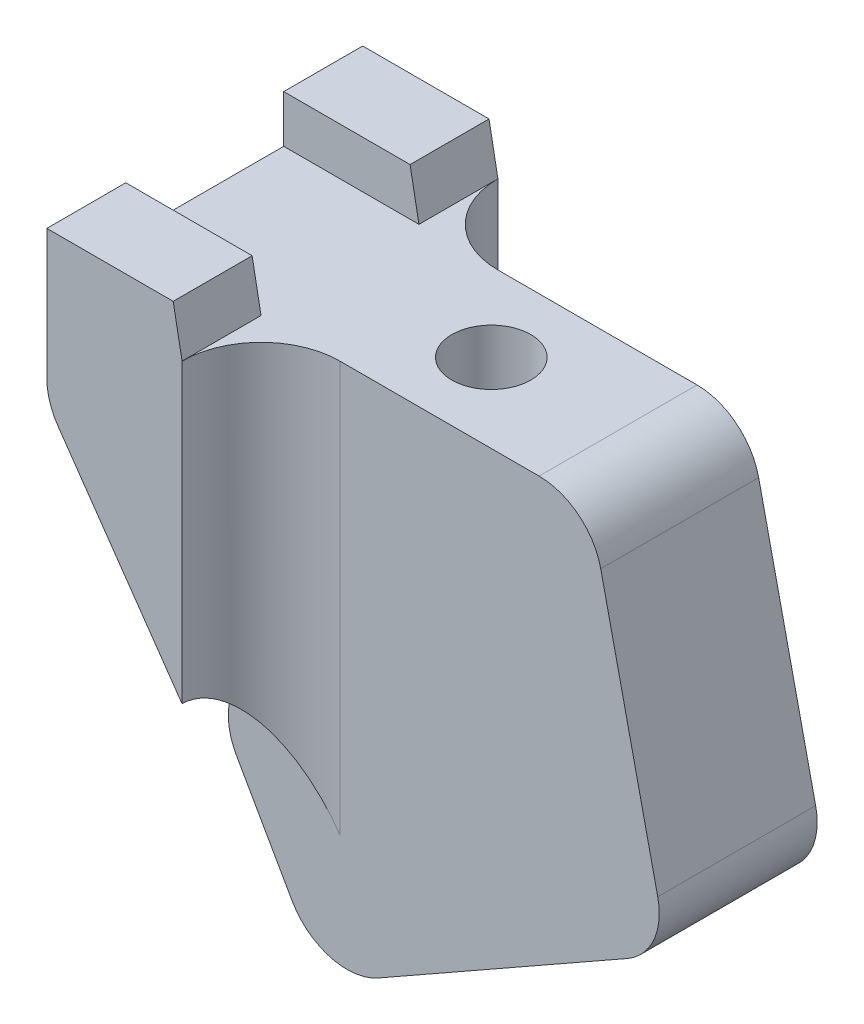
ISO-10303-21;
HEADER;
FILE_DESCRIPTION(('STEP AP214'),'2;1');
FILE_NAME('part.step','',(''),(''),'','','');
FILE_SCHEMA(('AUTOMOTIVE_DESIGN { 1 0 10303 214 1 1 1 1 }'));
ENDSEC;
DATA;
#1=APPLICATION_CONTEXT('core data for automotive mechanical design processes');
#2=APPLICATION_PROTOCOL_DEFINITION('international standard','automotive_design',2000,#1);
#3=PRODUCT_CONTEXT('',#1,'mechanical');
#4=PRODUCT('Part','Part','',(#3));
#5=PRODUCT_RELATED_PRODUCT_CATEGORY('part','',(#4));
#6=PRODUCT_DEFINITION_FORMATION('','',#4);
#7=PRODUCT_DEFINITION_CONTEXT('part definition',#1,'design');
#8=PRODUCT_DEFINITION('design','',#6,#7);
#9=PRODUCT_DEFINITION_SHAPE('','',#8);
#10=(LENGTH_UNIT() NAMED_UNIT(*) SI_UNIT(.MILLI.,.METRE.));
#11=(NAMED_UNIT(*) PLANE_ANGLE_UNIT() SI_UNIT($,.RADIAN.));
#12=(NAMED_UNIT(*) SI_UNIT($,.STERADIAN.) SOLID_ANGLE_UNIT());
#13=UNCERTAINTY_MEASURE_WITH_UNIT(LENGTH_MEASURE(1.E-05),#10,'distance_accuracy_value','');
#14=(GEOMETRIC_REPRESENTATION_CONTEXT(3) GLOBAL_UNCERTAINTY_ASSIGNED_CONTEXT((#13)) GLOBAL_UNIT_ASSIGNED_CONTEXT((#10,
#11,#12)) REPRESENTATION_CONTEXT('',''));
#15=CARTESIAN_POINT('',(0.,0.,0.));
#16=DIRECTION('',(0.,0.,1.));
#17=DIRECTION('',(1.,0.,0.));
#18=AXIS2_PLACEMENT_3D('',#15,#16,#17);
#19=CARTESIAN_POINT('',(48.0061463290764,35.3041192340742,-1.));
#20=DIRECTION('',(0.,0.,1.));
#21=DIRECTION('',(1.,0.,0.));
#22=AXIS2_PLACEMENT_3D('',#19,#20,#21);
#23=PLANE('',#22);
#24=DIRECTION('',(-1.,0.,0.));
#25=VECTOR('',#24,1.);
#26=CARTESIAN_POINT('',(33.9958629757308,64.4408077218012,-1.));
#27=LINE('',#26,#25);
#28=CARTESIAN_POINT('',(60.1642670724651,64.4408077218012,-1.));
#29=VERTEX_POINT('',#28);
#30=CARTESIAN_POINT('',(47.558151595833,64.4408077218012,-1.));
#31=VERTEX_POINT('',#30);
#32=EDGE_CURVE('E339',#29,#31,#27,.T.);
#33=ORIENTED_EDGE('',*,*,#32,.T.);
#34=DIRECTION('',(0.,-1.,0.));
#35=VECTOR('',#34,1.);
#36=CARTESIAN_POINT('',(47.558151595833,45.6512282761422,-1.));
#37=LINE('',#36,#35);
#38=CARTESIAN_POINT('',(47.558151595833,45.6512282761422,-1.));
#39=VERTEX_POINT('',#38);
#40=EDGE_CURVE('E389',#31,#39,#37,.T.);
#41=ORIENTED_EDGE('',*,*,#40,.T.);
#42=DIRECTION('',(0.,1.,0.));
#43=VECTOR('',#42,1.);
#44=CARTESIAN_POINT('',(47.558151595833,42.0557055238076,-1.));
#45=LINE('',#44,#43);
#46=CARTESIAN_POINT('',(47.558151595833,38.4601827714731,-1.));
#47=VERTEX_POINT('',#46);
#48=EDGE_CURVE('E384',#39,#47,#45,.F.);
#49=ORIENTED_EDGE('',*,*,#48,.T.);
#50=DIRECTION('',(-0.570874703175467,0.821037193599853,0.));
#51=VECTOR('',#50,1.);
#52=CARTESIAN_POINT('',(42.558151595833,45.6512282761422,-1.));
#53=LINE('',#52,#51);
#54=CARTESIAN_POINT('',(42.558151595833,45.6512282761422,-1.));
#55=VERTEX_POINT('',#54);
#56=EDGE_CURVE('E387',#47,#55,#53,.T.);
#57=ORIENTED_EDGE('',*,*,#56,.T.);
#58=DIRECTION('',(-0.589185933450439,-0.807997485035774,0.));
#59=VECTOR('',#58,1.);
#60=CARTESIAN_POINT('',(41.2535200061018,43.8620833160314,-1.));
#61=LINE('',#60,#59);
#62=CARTESIAN_POINT('',(41.2535200061018,43.8620833160314,-1.));
#63=VERTEX_POINT('',#62);
#64=EDGE_CURVE('E342',#55,#63,#61,.T.);
#65=ORIENTED_EDGE('',*,*,#64,.T.);
#66=CARTESIAN_POINT('',(44.4855099462449,41.5053395822297,-1.));
#67=DIRECTION('',(0.,0.,1.));
#68=DIRECTION('',(1.,0.,0.));
#69=AXIS2_PLACEMENT_3D('',#66,#67,#68);
#70=CIRCLE('',#69,4.);
#71=CARTESIAN_POINT('',(41.0070130927053,39.5304827165518,-1.));
#72=VERTEX_POINT('',#71);
#73=EDGE_CURVE('E345',#63,#72,#70,.T.);
#74=ORIENTED_EDGE('',*,*,#73,.T.);
#75=DIRECTION('',(0.493714216419472,-0.8696242133849,0.));
#76=VECTOR('',#75,1.);
#77=CARTESIAN_POINT('',(44.5276494755368,33.3292623683963,-1.));
#78=LINE('',#77,#76);
#79=CARTESIAN_POINT('',(44.5276494755368,33.3292623683963,-1.));
#80=VERTEX_POINT('',#79);
#81=EDGE_CURVE('E298',#72,#80,#78,.T.);
#82=ORIENTED_EDGE('',*,*,#81,.T.);
#83=CARTESIAN_POINT('',(48.0061463290764,35.3041192340742,-1.));
#84=DIRECTION('',(0.,0.,1.));
#85=DIRECTION('',(1.,0.,0.));
#86=AXIS2_PLACEMENT_3D('',#83,#84,#85);
#87=CIRCLE('',#86,4.);
#88=CARTESIAN_POINT('',(49.9810031947543,31.8256223805346,-1.));
#89=VERTEX_POINT('',#88);
#90=EDGE_CURVE('E293',#80,#89,#87,.T.);
#91=ORIENTED_EDGE('',*,*,#90,.T.);
#92=DIRECTION('',(0.8696242133849,0.493714216419473,0.));
#93=VECTOR('',#92,1.);
#94=CARTESIAN_POINT('',(65.7477490974415,40.7769216647747,-1.));
#95=LINE('',#94,#93);
#96=CARTESIAN_POINT('',(65.7477490974415,40.7769216647747,-1.));
#97=VERTEX_POINT('',#96);
#98=EDGE_CURVE('E326',#89,#97,#95,.T.);
#99=ORIENTED_EDGE('',*,*,#98,.T.);
#100=CARTESIAN_POINT('',(63.7728922317636,44.2554185183143,-1.));
#101=DIRECTION('',(0.,0.,1.));
#102=DIRECTION('',(-1.,0.,0.));
#103=AXIS2_PLACEMENT_3D('',#100,#101,#102);
#104=CIRCLE('',#103,3.99999999999999);
#105=CARTESIAN_POINT('',(67.6770330899851,45.1258690678376,-1.));
#106=VERTEX_POINT('',#105);
#107=EDGE_CURVE('E329',#97,#106,#104,.T.);
#108=ORIENTED_EDGE('',*,*,#107,.T.);
#109=DIRECTION('',(-0.217612637380822,0.976035214555378,0.));
#110=VECTOR('',#109,1.);
#111=CARTESIAN_POINT('',(64.0684079306866,61.3112582713245,-1.));
#112=LINE('',#111,#110);
#113=CARTESIAN_POINT('',(64.0684079306866,61.3112582713245,-1.));
#114=VERTEX_POINT('',#113);
#115=EDGE_CURVE('E332',#106,#114,#112,.T.);
#116=ORIENTED_EDGE('',*,*,#115,.T.);
#117=CARTESIAN_POINT('',(60.1642670724651,60.4408077218012,-1.));
#118=DIRECTION('',(0.,0.,1.));
#119=DIRECTION('',(-1.,0.,0.));
#120=AXIS2_PLACEMENT_3D('',#117,#118,#119);
#121=CIRCLE('',#120,4.);
#122=EDGE_CURVE('E335',#114,#29,#121,.T.);
#123=ORIENTED_EDGE('',*,*,#122,.T.);
#124=EDGE_LOOP('',(#33,#41,#49,#57,#65,#74,#82,#91,#99,#108,#116,#123));
#125=FACE_BOUND('',#124,.T.);
#126=ADVANCED_FACE('F38',(#125),#23,.T.);
#127=CARTESIAN_POINT('',(48.0061463290764,35.3041192340742,-11.));
#128=DIRECTION('',(0.,0.,1.));
#129=DIRECTION('',(1.,0.,0.));
#130=AXIS2_PLACEMENT_3D('',#127,#128,#129);
#131=PLANE('',#130);
#132=DIRECTION('',(-0.589185933450439,-0.807997485035774,0.));
#133=VECTOR('',#132,1.);
#134=CARTESIAN_POINT('',(41.2535200061018,43.8620833160314,-11.));
#135=LINE('',#134,#133);
#136=CARTESIAN_POINT('',(42.558151595833,45.6512282761422,-11.));
#137=VERTEX_POINT('',#136);
#138=CARTESIAN_POINT('',(41.2535200061018,43.8620833160314,-11.));
#139=VERTEX_POINT('',#138);
#140=EDGE_CURVE('E314',#137,#139,#135,.T.);
#141=ORIENTED_EDGE('',*,*,#140,.F.);
#142=DIRECTION('',(0.570874703175467,-0.821037193599853,0.));
#143=VECTOR('',#142,1.);
#144=CARTESIAN_POINT('',(49.1834286845458,36.122694470947,-11.));
#145=LINE('',#144,#143);
#146=CARTESIAN_POINT('',(47.558151595833,38.4601827714731,-11.));
#147=VERTEX_POINT('',#146);
#148=EDGE_CURVE('E381',#137,#147,#145,.T.);
#149=ORIENTED_EDGE('',*,*,#148,.T.);
#150=DIRECTION('',(0.,1.,0.));
#151=VECTOR('',#150,1.);
#152=CARTESIAN_POINT('',(47.558151595833,42.0557055238076,-11.));
#153=LINE('',#152,#151);
#154=CARTESIAN_POINT('',(47.558151595833,45.6512282761422,-11.));
#155=VERTEX_POINT('',#154);
#156=EDGE_CURVE('E379',#147,#155,#153,.T.);
#157=ORIENTED_EDGE('',*,*,#156,.T.);
#158=DIRECTION('',(0.,-1.,0.));
#159=VECTOR('',#158,1.);
#160=CARTESIAN_POINT('',(47.558151595833,64.4408077218012,-11.));
#161=LINE('',#160,#159);
#162=CARTESIAN_POINT('',(47.558151595833,64.4408077218012,-11.));
#163=VERTEX_POINT('',#162);
#164=EDGE_CURVE('E353',#155,#163,#161,.F.);
#165=ORIENTED_EDGE('',*,*,#164,.T.);
#166=DIRECTION('',(-1.,0.,0.));
#167=VECTOR('',#166,1.);
#168=CARTESIAN_POINT('',(33.9958629757308,64.4408077218012,-11.));
#169=LINE('',#168,#167);
#170=CARTESIAN_POINT('',(60.1642670724651,64.4408077218012,-11.));
#171=VERTEX_POINT('',#170);
#172=EDGE_CURVE('E311',#171,#163,#169,.T.);
#173=ORIENTED_EDGE('',*,*,#172,.F.);
#174=CARTESIAN_POINT('',(60.1642670724651,60.4408077218012,-11.));
#175=DIRECTION('',(0.,0.,1.));
#176=DIRECTION('',(-1.,0.,0.));
#177=AXIS2_PLACEMENT_3D('',#174,#175,#176);
#178=CIRCLE('',#177,4.);
#179=CARTESIAN_POINT('',(64.0684079306866,61.3112582713245,-11.));
#180=VERTEX_POINT('',#179);
#181=EDGE_CURVE('E307',#180,#171,#178,.T.);
#182=ORIENTED_EDGE('',*,*,#181,.F.);
#183=DIRECTION('',(-0.217612637380822,0.976035214555378,0.));
#184=VECTOR('',#183,1.);
#185=CARTESIAN_POINT('',(64.0684079306866,61.3112582713245,-11.));
#186=LINE('',#185,#184);
#187=CARTESIAN_POINT('',(67.6770330899851,45.1258690678376,-11.));
#188=VERTEX_POINT('',#187);
#189=EDGE_CURVE('E304',#188,#180,#186,.T.);
#190=ORIENTED_EDGE('',*,*,#189,.F.);
#191=CARTESIAN_POINT('',(63.7728922317636,44.2554185183143,-11.));
#192=DIRECTION('',(0.,0.,1.));
#193=DIRECTION('',(-1.,0.,0.));
#194=AXIS2_PLACEMENT_3D('',#191,#192,#193);
#195=CIRCLE('',#194,3.99999999999999);
#196=CARTESIAN_POINT('',(65.7477490974415,40.7769216647747,-11.));
#197=VERTEX_POINT('',#196);
#198=EDGE_CURVE('E301',#197,#188,#195,.T.);
#199=ORIENTED_EDGE('',*,*,#198,.F.);
#200=DIRECTION('',(0.8696242133849,0.493714216419473,0.));
#201=VECTOR('',#200,1.);
#202=CARTESIAN_POINT('',(65.7477490974415,40.7769216647747,-11.));
#203=LINE('',#202,#201);
#204=CARTESIAN_POINT('',(49.9810031947543,31.8256223805346,-11.));
#205=VERTEX_POINT('',#204);
#206=EDGE_CURVE('E297',#205,#197,#203,.T.);
#207=ORIENTED_EDGE('',*,*,#206,.F.);
#208=CARTESIAN_POINT('',(48.0061463290764,35.3041192340742,-11.));
#209=DIRECTION('',(0.,0.,1.));
#210=DIRECTION('',(1.,0.,0.));
#211=AXIS2_PLACEMENT_3D('',#208,#209,#210);
#212=CIRCLE('',#211,4.);
#213=CARTESIAN_POINT('',(44.5276494755368,33.3292623683963,-11.));
#214=VERTEX_POINT('',#213);
#215=EDGE_CURVE('E294',#214,#205,#212,.T.);
#216=ORIENTED_EDGE('',*,*,#215,.F.);
#217=DIRECTION('',(0.493714216419472,-0.8696242133849,0.));
#218=VECTOR('',#217,1.);
#219=CARTESIAN_POINT('',(44.5276494755368,33.3292623683963,-11.));
#220=LINE('',#219,#218);
#221=CARTESIAN_POINT('',(41.0070130927053,39.5304827165518,-11.));
#222=VERTEX_POINT('',#221);
#223=EDGE_CURVE('E320',#222,#214,#220,.T.);
#224=ORIENTED_EDGE('',*,*,#223,.F.);
#225=CARTESIAN_POINT('',(44.4855099462449,41.5053395822297,-11.));
#226=DIRECTION('',(0.,0.,1.));
#227=DIRECTION('',(1.,0.,0.));
#228=AXIS2_PLACEMENT_3D('',#225,#226,#227);
#229=CIRCLE('',#228,4.);
#230=EDGE_CURVE('E317',#139,#222,#229,.T.);
#231=ORIENTED_EDGE('',*,*,#230,.F.);
#232=EDGE_LOOP('',(#141,#149,#157,#165,#173,#182,#190,#199,#207,#216,#224,#231));
#233=FACE_BOUND('',#232,.T.);
#234=ADVANCED_FACE('F431',(#233),#131,.F.);
#235=CARTESIAN_POINT('',(48.0061463290764,35.3041192340742,-11.));
#236=DIRECTION('',(0.,0.,1.));
#237=DIRECTION('',(1.,0.,0.));
#238=AXIS2_PLACEMENT_3D('',#235,#236,#237);
#239=CYLINDRICAL_SURFACE('',#238,4.);
#240=CARTESIAN_POINT('',(44.5276494755368,33.3292623683963,-5.43616808992549));
#241=CARTESIAN_POINT('',(44.5339848325079,33.3181342159189,-5.36394516998186));
#242=CARTESIAN_POINT('',(44.5387697051523,33.3097998319075,-5.29115761905606));
#243=CARTESIAN_POINT('',(44.5451349867196,33.2987586815971,-5.14557719709556));
#244=CARTESIAN_POINT('',(44.5467395515035,33.296009489243,-5.07278859854778));
#245=CARTESIAN_POINT('',(44.5467395515035,33.296009489243,-4.92721140145222));
#246=CARTESIAN_POINT('',(44.5451349867196,33.2987586815971,-4.85442280290444));
#247=CARTESIAN_POINT('',(44.5387697051523,33.3097998319075,-4.70884238094394));
#248=CARTESIAN_POINT('',(44.5339848325079,33.3181342159189,-4.63605483001814));
#249=CARTESIAN_POINT('',(44.5276494755368,33.3292623683963,-4.56383191007451));
#250=B_SPLINE_CURVE_WITH_KNOTS('',3,(#240,#241,#242,#243,#244,#245,#246,#247,#248,#249),
.UNSPECIFIED.,.F.,.F.,(4,2,2,2,4),(0.,0.219974305151584,0.438271304768254,0.656568304384924,
0.876542609536507),.UNSPECIFIED.);
#251=CARTESIAN_POINT('',(44.5276494755368,33.3292623683963,-5.43616808992549));
#252=VERTEX_POINT('',#251);
#253=CARTESIAN_POINT('',(44.5276494755368,33.3292623683963,-4.56383191007451));
#254=VERTEX_POINT('',#253);
#255=EDGE_CURVE('E58',#252,#254,#250,.T.);
#256=ORIENTED_EDGE('',*,*,#255,.F.);
#257=DIRECTION('',(0.,0.,1.));
#258=VECTOR('',#257,1.);
#259=CARTESIAN_POINT('',(44.5276494755368,33.3292623683963,-11.));
#260=LINE('',#259,#258);
#261=EDGE_CURVE('E350',#214,#252,#260,.T.);
#262=ORIENTED_EDGE('',*,*,#261,.F.);
#263=ORIENTED_EDGE('',*,*,#215,.T.);
#264=DIRECTION('',(0.,0.,1.));
#265=VECTOR('',#264,1.);
#266=CARTESIAN_POINT('',(49.9810031947543,31.8256223805346,-11.));
#267=LINE('',#266,#265);
#268=EDGE_CURVE('E323',#205,#89,#267,.T.);
#269=ORIENTED_EDGE('',*,*,#268,.T.);
#270=ORIENTED_EDGE('',*,*,#90,.F.);
#271=EDGE_CURVE('E354',#254,#80,#260,.T.);
#272=ORIENTED_EDGE('',*,*,#271,.F.);
#273=EDGE_LOOP('',(#256,#262,#263,#269,#270,#272));
#274=FACE_BOUND('',#273,.T.);
#275=ADVANCED_FACE('F449',(#274),#239,.T.);
#276=CARTESIAN_POINT('',(44.5276494755368,33.3292623683963,-11.));
#277=DIRECTION('',(-0.8696242133849,-0.493714216419472,0.));
#278=DIRECTION('',(0.493714216419472,-0.8696242133849,0.));
#279=AXIS2_PLACEMENT_3D('',#276,#277,#278);
#280=PLANE('',#279);
#281=CARTESIAN_POINT('',(43.3122941968989,35.4699792913027,-5.));
#282=DIRECTION('',(-0.8696242133849,-0.493714216419472,0.));
#283=DIRECTION('',(0.493714216419472,-0.8696242133849,0.));
#284=AXIS2_PLACEMENT_3D('',#281,#282,#283);
#285=CIRCLE('',#284,2.5);
#286=EDGE_CURVE('E208',#254,#252,#285,.T.);
#287=ORIENTED_EDGE('',*,*,#286,.F.);
#288=ORIENTED_EDGE('',*,*,#271,.T.);
#289=ORIENTED_EDGE('',*,*,#81,.F.);
#290=DIRECTION('',(0.,0.,1.));
#291=VECTOR('',#290,1.);
#292=CARTESIAN_POINT('',(41.0070130927053,39.5304827165518,-11.));
#293=LINE('',#292,#291);
#294=EDGE_CURVE('E355',#222,#72,#293,.T.);
#295=ORIENTED_EDGE('',*,*,#294,.F.);
#296=ORIENTED_EDGE('',*,*,#223,.T.);
#297=ORIENTED_EDGE('',*,*,#261,.T.);
#298=EDGE_LOOP('',(#287,#288,#289,#295,#296,#297));
#299=FACE_BOUND('',#298,.T.);
#300=ADVANCED_FACE('F453',(#299),#280,.T.);
#301=CARTESIAN_POINT('',(44.4855099462449,41.5053395822297,-11.));
#302=DIRECTION('',(0.,0.,1.));
#303=DIRECTION('',(1.,0.,0.));
#304=AXIS2_PLACEMENT_3D('',#301,#302,#303);
#305=CYLINDRICAL_SURFACE('',#304,4.);
#306=ORIENTED_EDGE('',*,*,#73,.F.);
#307=DIRECTION('',(0.,0.,1.));
#308=VECTOR('',#307,1.);
#309=CARTESIAN_POINT('',(41.2535200061018,43.8620833160314,-11.));
#310=LINE('',#309,#308);
#311=EDGE_CURVE('E357',#139,#63,#310,.T.);
#312=ORIENTED_EDGE('',*,*,#311,.F.);
#313=ORIENTED_EDGE('',*,*,#230,.T.);
#314=ORIENTED_EDGE('',*,*,#294,.T.);
#315=EDGE_LOOP('',(#306,#312,#313,#314));
#316=FACE_BOUND('',#315,.T.);
#317=ADVANCED_FACE('F515',(#316),#305,.T.);
#318=CARTESIAN_POINT('',(41.2535200061018,43.8620833160314,-11.));
#319=DIRECTION('',(-0.807997485035774,0.589185933450439,0.));
#320=DIRECTION('',(-0.589185933450439,-0.807997485035774,0.));
#321=AXIS2_PLACEMENT_3D('',#318,#319,#320);
#322=PLANE('',#321);
#323=ORIENTED_EDGE('',*,*,#64,.F.);
#324=DIRECTION('',(0.,0.,1.));
#325=VECTOR('',#324,1.);
#326=CARTESIAN_POINT('',(42.558151595833,45.6512282761422,-11.));
#327=LINE('',#326,#325);
#328=EDGE_CURVE('E359',#137,#55,#327,.T.);
#329=ORIENTED_EDGE('',*,*,#328,.F.);
#330=ORIENTED_EDGE('',*,*,#140,.T.);
#331=ORIENTED_EDGE('',*,*,#311,.T.);
#332=EDGE_LOOP('',(#323,#329,#330,#331));
#333=FACE_BOUND('',#332,.T.);
#334=ADVANCED_FACE('F460',(#333),#322,.T.);
#335=CARTESIAN_POINT('',(42.558151595833,45.6512282761422,-11.));
#336=DIRECTION('',(-0.821037193599853,-0.570874703175467,0.));
#337=DIRECTION('',(0.570874703175467,-0.821037193599853,0.));
#338=AXIS2_PLACEMENT_3D('',#335,#336,#337);
#339=PLANE('',#338);
#340=ORIENTED_EDGE('',*,*,#328,.T.);
#341=ORIENTED_EDGE('',*,*,#56,.F.);
#342=CARTESIAN_POINT('',(47.558151595833,38.4601827714731,4.));
#343=DIRECTION('',(-0.821037193599853,-0.570874703175467,0.));
#344=DIRECTION('',(-0.570874703175467,0.821037193599853,0.));
#345=AXIS2_PLACEMENT_3D('',#342,#343,#344);
#346=ELLIPSE('',#345,8.75848933607972,5.);
#347=CARTESIAN_POINT('',(42.558151595833,45.6512282761422,4.));
#348=VERTEX_POINT('',#347);
#349=EDGE_CURVE('E397',#47,#348,#346,.F.);
#350=ORIENTED_EDGE('',*,*,#349,.T.);
#351=DIRECTION('',(-0.570874703175466,0.821037193599853,0.));
#352=VECTOR('',#351,1.);
#353=CARTESIAN_POINT('',(34.7117142013314,56.9360459468219,4.));
#354=LINE('',#353,#352);
#355=CARTESIAN_POINT('',(34.7117142013314,56.9360459468219,4.));
#356=VERTEX_POINT('',#355);
#357=EDGE_CURVE('E241',#348,#356,#354,.T.);
#358=ORIENTED_EDGE('',*,*,#357,.T.);
#359=DIRECTION('',(0.,0.,1.));
#360=VECTOR('',#359,1.);
#361=CARTESIAN_POINT('',(34.7117142013314,56.9360459468219,-11.));
#362=LINE('',#361,#360);
#363=CARTESIAN_POINT('',(34.7117142013314,56.9360459468219,-16.));
#364=VERTEX_POINT('',#363);
#365=EDGE_CURVE('E362',#364,#356,#362,.T.);
#366=ORIENTED_EDGE('',*,*,#365,.F.);
#367=DIRECTION('',(-0.570874703175466,0.821037193599853,0.));
#368=VECTOR('',#367,1.);
#369=CARTESIAN_POINT('',(34.7117142013314,56.9360459468219,-16.));
#370=LINE('',#369,#368);
#371=CARTESIAN_POINT('',(42.558151595833,45.6512282761422,-16.));
#372=VERTEX_POINT('',#371);
#373=EDGE_CURVE('E276',#372,#364,#370,.T.);
#374=ORIENTED_EDGE('',*,*,#373,.F.);
#375=CARTESIAN_POINT('',(47.558151595833,38.4601827714731,-16.));
#376=DIRECTION('',(-0.821037193599853,-0.570874703175467,0.));
#377=DIRECTION('',(-0.570874703175467,0.821037193599853,0.));
#378=AXIS2_PLACEMENT_3D('',#375,#376,#377);
#379=ELLIPSE('',#378,8.75848933607972,5.);
#380=EDGE_CURVE('E392',#372,#147,#379,.F.);
#381=ORIENTED_EDGE('',*,*,#380,.T.);
#382=ORIENTED_EDGE('',*,*,#148,.F.);
#383=EDGE_LOOP('',(#340,#341,#350,#358,#366,#374,#381,#382));
#384=FACE_BOUND('',#383,.T.);
#385=ADVANCED_FACE('F463',(#384),#339,.T.);
#386=CARTESIAN_POINT('',(37.9958629757308,59.2195447595238,-11.));
#387=DIRECTION('',(0.,0.,1.));
#388=DIRECTION('',(1.,0.,0.));
#389=AXIS2_PLACEMENT_3D('',#386,#387,#388);
#390=CYLINDRICAL_SURFACE('',#389,3.99999999999999);
#391=ORIENTED_EDGE('',*,*,#365,.T.);
#392=CARTESIAN_POINT('',(37.9958629757308,59.2195447595238,4.));
#393=DIRECTION('',(0.,0.,-1.));
#394=DIRECTION('',(-1.,0.,0.));
#395=AXIS2_PLACEMENT_3D('',#392,#393,#394);
#396=CIRCLE('',#395,3.99999999999999);
#397=CARTESIAN_POINT('',(33.9958629757308,59.2195447595238,4.));
#398=VERTEX_POINT('',#397);
#399=EDGE_CURVE('E237',#356,#398,#396,.T.);
#400=ORIENTED_EDGE('',*,*,#399,.T.);
#401=DIRECTION('',(0.,0.,1.));
#402=VECTOR('',#401,1.);
#403=CARTESIAN_POINT('',(33.9958629757308,59.2195447595238,-11.));
#404=LINE('',#403,#402);
#405=CARTESIAN_POINT('',(33.9958629757308,59.2195447595238,-16.));
#406=VERTEX_POINT('',#405);
#407=EDGE_CURVE('E364',#406,#398,#404,.T.);
#408=ORIENTED_EDGE('',*,*,#407,.F.);
#409=CARTESIAN_POINT('',(37.9958629757308,59.2195447595238,-16.));
#410=DIRECTION('',(0.,0.,-1.));
#411=DIRECTION('',(-1.,0.,0.));
#412=AXIS2_PLACEMENT_3D('',#409,#410,#411);
#413=CIRCLE('',#412,3.99999999999999);
#414=EDGE_CURVE('E279',#364,#406,#413,.T.);
#415=ORIENTED_EDGE('',*,*,#414,.F.);
#416=EDGE_LOOP('',(#391,#400,#408,#415));
#417=FACE_BOUND('',#416,.T.);
#418=ADVANCED_FACE('F490',(#417),#390,.T.);
#419=CARTESIAN_POINT('',(33.9958629757308,64.4408077218012,-11.));
#420=DIRECTION('',(-1.,0.,0.));
#421=DIRECTION('',(0.,0.,1.));
#422=AXIS2_PLACEMENT_3D('',#419,#420,#421);
#423=PLANE('',#422);
#424=ORIENTED_EDGE('',*,*,#407,.T.);
#425=DIRECTION('',(0.,1.,0.));
#426=VECTOR('',#425,1.);
#427=CARTESIAN_POINT('',(33.9958629757308,64.4408077218012,4.));
#428=LINE('',#427,#426);
#429=CARTESIAN_POINT('',(33.9958629757308,67.4408077218012,4.));
#430=VERTEX_POINT('',#429);
#431=EDGE_CURVE('E234',#398,#430,#428,.T.);
#432=ORIENTED_EDGE('',*,*,#431,.T.);
#433=DIRECTION('',(0.,0.,-1.));
#434=VECTOR('',#433,1.);
#435=CARTESIAN_POINT('',(33.9958629757308,67.4408077218012,4.));
#436=LINE('',#435,#434);
#437=CARTESIAN_POINT('',(33.9958629757308,67.4408077218012,-1.));
#438=VERTEX_POINT('',#437);
#439=EDGE_CURVE('E253',#430,#438,#436,.T.);
#440=ORIENTED_EDGE('',*,*,#439,.T.);
#441=DIRECTION('',(0.,1.,0.));
#442=VECTOR('',#441,1.);
#443=CARTESIAN_POINT('',(33.9958629757308,64.4408077218012,-1.));
#444=LINE('',#443,#442);
#445=CARTESIAN_POINT('',(33.9958629757308,64.4408077218012,-1.));
#446=VERTEX_POINT('',#445);
#447=EDGE_CURVE('E224',#446,#438,#444,.T.);
#448=ORIENTED_EDGE('',*,*,#447,.F.);
#449=DIRECTION('',(0.,0.,1.));
#450=VECTOR('',#449,1.);
#451=CARTESIAN_POINT('',(33.9958629757308,64.4408077218012,-11.));
#452=LINE('',#451,#450);
#453=CARTESIAN_POINT('',(33.9958629757308,64.4408077218012,-11.));
#454=VERTEX_POINT('',#453);
#455=EDGE_CURVE('E366',#454,#446,#452,.T.);
#456=ORIENTED_EDGE('',*,*,#455,.F.);
#457=DIRECTION('',(0.,1.,0.));
#458=VECTOR('',#457,1.);
#459=CARTESIAN_POINT('',(33.9958629757308,64.4408077218012,-11.));
#460=LINE('',#459,#458);
#461=CARTESIAN_POINT('',(33.9958629757308,67.4408077218012,-11.));
#462=VERTEX_POINT('',#461);
#463=EDGE_CURVE('E269',#454,#462,#460,.T.);
#464=ORIENTED_EDGE('',*,*,#463,.T.);
#465=DIRECTION('',(0.,0.,1.));
#466=VECTOR('',#465,1.);
#467=CARTESIAN_POINT('',(33.9958629757308,67.4408077218012,-16.));
#468=LINE('',#467,#466);
#469=CARTESIAN_POINT('',(33.9958629757308,67.4408077218012,-16.));
#470=VERTEX_POINT('',#469);
#471=EDGE_CURVE('E290',#470,#462,#468,.T.);
#472=ORIENTED_EDGE('',*,*,#471,.F.);
#473=DIRECTION('',(0.,1.,0.));
#474=VECTOR('',#473,1.);
#475=CARTESIAN_POINT('',(33.9958629757308,64.4408077218012,-16.));
#476=LINE('',#475,#474);
#477=EDGE_CURVE('E265',#406,#470,#476,.T.);
#478=ORIENTED_EDGE('',*,*,#477,.F.);
#479=EDGE_LOOP('',(#424,#432,#440,#448,#456,#464,#472,#478));
#480=FACE_BOUND('',#479,.T.);
#481=ADVANCED_FACE('F482',(#480),#423,.T.);
#482=CARTESIAN_POINT('',(33.9958629757308,64.4408077218012,-11.));
#483=DIRECTION('',(0.,1.,0.));
#484=DIRECTION('',(0.,0.,1.));
#485=AXIS2_PLACEMENT_3D('',#482,#483,#484);
#486=PLANE('',#485);
#487=CARTESIAN_POINT('',(52.138844977512,64.4408077218012,-6.));
#488=DIRECTION('',(0.,1.,0.));
#489=DIRECTION('',(0.,0.,1.));
#490=AXIS2_PLACEMENT_3D('',#487,#488,#489);
#491=CIRCLE('',#490,2.5);
#492=CARTESIAN_POINT('',(52.138844977512,64.4408077218012,-3.5));
#493=VERTEX_POINT('',#492);
#494=EDGE_CURVE('E804',#493,#493,#491,.T.);
#495=ORIENTED_EDGE('',*,*,#494,.F.);
#496=EDGE_LOOP('',(#495));
#497=FACE_BOUND('',#496,.T.);
#498=ORIENTED_EDGE('',*,*,#32,.F.);
#499=DIRECTION('',(0.,0.,1.));
#500=VECTOR('',#499,1.);
#501=CARTESIAN_POINT('',(60.1642670724651,64.4408077218012,-11.));
#502=LINE('',#501,#500);
#503=EDGE_CURVE('E369',#171,#29,#502,.T.);
#504=ORIENTED_EDGE('',*,*,#503,.F.);
#505=ORIENTED_EDGE('',*,*,#172,.T.);
#506=CARTESIAN_POINT('',(47.558151595833,64.4408077218012,-16.));
#507=DIRECTION('',(0.,1.,0.));
#508=DIRECTION('',(0.,0.,1.));
#509=AXIS2_PLACEMENT_3D('',#506,#507,#508);
#510=CIRCLE('',#509,5.);
#511=CARTESIAN_POINT('',(42.558151595833,64.4408077218012,-16.));
#512=VERTEX_POINT('',#511);
#513=EDGE_CURVE('E394',#163,#512,#510,.F.);
#514=ORIENTED_EDGE('',*,*,#513,.T.);
#515=DIRECTION('',(0.,0.,-1.));
#516=VECTOR('',#515,1.);
#517=CARTESIAN_POINT('',(42.558151595833,64.4408077218012,-16.));
#518=LINE('',#517,#516);
#519=CARTESIAN_POINT('',(42.558151595833,64.4408077218012,-11.));
#520=VERTEX_POINT('',#519);
#521=EDGE_CURVE('E401',#520,#512,#518,.T.);
#522=ORIENTED_EDGE('',*,*,#521,.F.);
#523=EDGE_CURVE('E310',#520,#454,#169,.T.);
#524=ORIENTED_EDGE('',*,*,#523,.T.);
#525=ORIENTED_EDGE('',*,*,#455,.T.);
#526=CARTESIAN_POINT('',(42.558151595833,64.4408077218012,-1.));
#527=VERTEX_POINT('',#526);
#528=EDGE_CURVE('E338',#527,#446,#27,.T.);
#529=ORIENTED_EDGE('',*,*,#528,.F.);
#530=DIRECTION('',(0.,0.,1.));
#531=VECTOR('',#530,1.);
#532=CARTESIAN_POINT('',(42.558151595833,64.4408077218012,4.));
#533=LINE('',#532,#531);
#534=CARTESIAN_POINT('',(42.558151595833,64.4408077218012,3.99999625269905));
#535=VERTEX_POINT('',#534);
#536=EDGE_CURVE('E205',#527,#535,#533,.T.);
#537=ORIENTED_EDGE('',*,*,#536,.T.);
#538=CARTESIAN_POINT('',(47.558151595833,64.4408077218012,4.));
#539=DIRECTION('',(0.,1.,0.));
#540=DIRECTION('',(0.,0.,1.));
#541=AXIS2_PLACEMENT_3D('',#538,#539,#540);
#542=CIRCLE('',#541,5.);
#543=EDGE_CURVE('E399',#535,#31,#542,.F.);
#544=ORIENTED_EDGE('',*,*,#543,.T.);
#545=EDGE_LOOP('',(#498,#504,#505,#514,#522,#524,#525,#529,#537,#544));
#546=FACE_BOUND('',#545,.T.);
#547=ADVANCED_FACE('F408',(#497,#546),#486,.T.);
#548=CARTESIAN_POINT('',(60.1642670724651,60.4408077218012,-11.));
#549=DIRECTION('',(0.,0.,1.));
#550=DIRECTION('',(1.,0.,0.));
#551=AXIS2_PLACEMENT_3D('',#548,#549,#550);
#552=CYLINDRICAL_SURFACE('',#551,4.);
#553=ORIENTED_EDGE('',*,*,#122,.F.);
#554=DIRECTION('',(0.,0.,1.));
#555=VECTOR('',#554,1.);
#556=CARTESIAN_POINT('',(64.0684079306866,61.3112582713245,-11.));
#557=LINE('',#556,#555);
#558=EDGE_CURVE('E371',#180,#114,#557,.T.);
#559=ORIENTED_EDGE('',*,*,#558,.F.);
#560=ORIENTED_EDGE('',*,*,#181,.T.);
#561=ORIENTED_EDGE('',*,*,#503,.T.);
#562=EDGE_LOOP('',(#553,#559,#560,#561));
#563=FACE_BOUND('',#562,.T.);
#564=ADVANCED_FACE('F434',(#563),#552,.T.);
#565=CARTESIAN_POINT('',(64.0684079306866,61.3112582713245,-11.));
#566=DIRECTION('',(0.976035214555378,0.217612637380822,0.));
#567=DIRECTION('',(-0.217612637380822,0.976035214555378,0.));
#568=AXIS2_PLACEMENT_3D('',#565,#566,#567);
#569=PLANE('',#568);
#570=ORIENTED_EDGE('',*,*,#115,.F.);
#571=DIRECTION('',(0.,0.,1.));
#572=VECTOR('',#571,1.);
#573=CARTESIAN_POINT('',(67.6770330899851,45.1258690678376,-11.));
#574=LINE('',#573,#572);
#575=EDGE_CURVE('E373',#188,#106,#574,.T.);
#576=ORIENTED_EDGE('',*,*,#575,.F.);
#577=ORIENTED_EDGE('',*,*,#189,.T.);
#578=ORIENTED_EDGE('',*,*,#558,.T.);
#579=EDGE_LOOP('',(#570,#576,#577,#578));
#580=FACE_BOUND('',#579,.T.);
#581=ADVANCED_FACE('F437',(#580),#569,.T.);
#582=CARTESIAN_POINT('',(63.7728922317636,44.2554185183143,-11.));
#583=DIRECTION('',(0.,0.,1.));
#584=DIRECTION('',(1.,0.,0.));
#585=AXIS2_PLACEMENT_3D('',#582,#583,#584);
#586=CYLINDRICAL_SURFACE('',#585,3.99999999999999);
#587=ORIENTED_EDGE('',*,*,#107,.F.);
#588=DIRECTION('',(0.,0.,1.));
#589=VECTOR('',#588,1.);
#590=CARTESIAN_POINT('',(65.7477490974415,40.7769216647747,-11.));
#591=LINE('',#590,#589);
#592=EDGE_CURVE('E375',#197,#97,#591,.T.);
#593=ORIENTED_EDGE('',*,*,#592,.F.);
#594=ORIENTED_EDGE('',*,*,#198,.T.);
#595=ORIENTED_EDGE('',*,*,#575,.T.);
#596=EDGE_LOOP('',(#587,#593,#594,#595));
#597=FACE_BOUND('',#596,.T.);
#598=ADVANCED_FACE('F442',(#597),#586,.T.);
#599=CARTESIAN_POINT('',(65.7477490974415,40.7769216647747,-11.));
#600=DIRECTION('',(0.493714216419474,-0.8696242133849,0.));
#601=DIRECTION('',(0.8696242133849,0.493714216419474,0.));
#602=AXIS2_PLACEMENT_3D('',#599,#600,#601);
#603=PLANE('',#602);
#604=CARTESIAN_POINT('',(56.9743900207976,35.7959976803425,-6.));
#605=DIRECTION('',(0.493714216419474,-0.8696242133849,0.));
#606=DIRECTION('',(0.8696242133849,0.493714216419474,0.));
#607=AXIS2_PLACEMENT_3D('',#604,#605,#606);
#608=CIRCLE('',#607,2.5);
#609=CARTESIAN_POINT('',(59.1484505542599,37.0302832213912,-6.));
#610=VERTEX_POINT('',#609);
#611=EDGE_CURVE('E218',#610,#610,#608,.T.);
#612=ORIENTED_EDGE('',*,*,#611,.F.);
#613=EDGE_LOOP('',(#612));
#614=FACE_BOUND('',#613,.T.);
#615=ORIENTED_EDGE('',*,*,#98,.F.);
#616=ORIENTED_EDGE('',*,*,#268,.F.);
#617=ORIENTED_EDGE('',*,*,#206,.T.);
#618=ORIENTED_EDGE('',*,*,#592,.T.);
#619=EDGE_LOOP('',(#615,#616,#617,#618));
#620=FACE_BOUND('',#619,.T.);
#621=ADVANCED_FACE('F445',(#614,#620),#603,.T.);
#622=CARTESIAN_POINT('',(33.9958629757308,67.4408077218012,-16.));
#623=DIRECTION('',(0.,-1.,0.));
#624=DIRECTION('',(0.,0.,-1.));
#625=AXIS2_PLACEMENT_3D('',#622,#623,#624);
#626=PLANE('',#625);
#627=DIRECTION('',(1.,0.,0.));
#628=VECTOR('',#627,1.);
#629=CARTESIAN_POINT('',(33.9958629757308,67.4408077218012,-11.));
#630=LINE('',#629,#628);
#631=CARTESIAN_POINT('',(41.9958629757308,67.4408077218012,-11.));
#632=VERTEX_POINT('',#631);
#633=EDGE_CURVE('E264',#462,#632,#630,.T.);
#634=ORIENTED_EDGE('',*,*,#633,.T.);
#635=DIRECTION('',(0.,0.,1.));
#636=VECTOR('',#635,1.);
#637=CARTESIAN_POINT('',(41.9958629757308,67.4408077218012,-16.));
#638=LINE('',#637,#636);
#639=CARTESIAN_POINT('',(41.9958629757308,67.4408077218012,-16.));
#640=VERTEX_POINT('',#639);
#641=EDGE_CURVE('E282',#640,#632,#638,.T.);
#642=ORIENTED_EDGE('',*,*,#641,.F.);
#643=DIRECTION('',(1.,0.,0.));
#644=VECTOR('',#643,1.);
#645=CARTESIAN_POINT('',(33.9958629757308,67.4408077218012,-16.));
#646=LINE('',#645,#644);
#647=EDGE_CURVE('E268',#470,#640,#646,.T.);
#648=ORIENTED_EDGE('',*,*,#647,.F.);
#649=ORIENTED_EDGE('',*,*,#471,.T.);
#650=EDGE_LOOP('',(#634,#642,#648,#649));
#651=FACE_BOUND('',#650,.T.);
#652=ADVANCED_FACE('F496',(#651),#626,.F.);
#653=CARTESIAN_POINT('',(41.9958629757308,67.4408077218012,-16.));
#654=DIRECTION('',(-0.982884728782578,-0.184221632622224,0.));
#655=DIRECTION('',(0.184221632622224,-0.982884728782578,0.));
#656=AXIS2_PLACEMENT_3D('',#653,#654,#655);
#657=PLANE('',#656);
#658=DIRECTION('',(0.184221632622224,-0.982884728782578,0.));
#659=VECTOR('',#658,1.);
#660=CARTESIAN_POINT('',(41.9958629757308,67.4408077218012,-11.));
#661=LINE('',#660,#659);
#662=EDGE_CURVE('E284',#632,#520,#661,.T.);
#663=ORIENTED_EDGE('',*,*,#662,.T.);
#664=ORIENTED_EDGE('',*,*,#521,.T.);
#665=DIRECTION('',(0.184221632622224,-0.982884728782578,0.));
#666=VECTOR('',#665,1.);
#667=CARTESIAN_POINT('',(41.9958629757308,67.4408077218012,-16.));
#668=LINE('',#667,#666);
#669=EDGE_CURVE('E271',#640,#512,#668,.T.);
#670=ORIENTED_EDGE('',*,*,#669,.F.);
#671=ORIENTED_EDGE('',*,*,#641,.T.);
#672=EDGE_LOOP('',(#663,#664,#670,#671));
#673=FACE_BOUND('',#672,.T.);
#674=ADVANCED_FACE('F472',(#673),#657,.F.);
#675=CARTESIAN_POINT('',(37.9958629757308,59.2195447595238,-16.));
#676=DIRECTION('',(0.,0.,-1.));
#677=DIRECTION('',(-1.,0.,0.));
#678=AXIS2_PLACEMENT_3D('',#675,#676,#677);
#679=PLANE('',#678);
#680=ORIENTED_EDGE('',*,*,#477,.T.);
#681=ORIENTED_EDGE('',*,*,#647,.T.);
#682=ORIENTED_EDGE('',*,*,#669,.T.);
#683=DIRECTION('',(0.,-1.,0.));
#684=VECTOR('',#683,1.);
#685=CARTESIAN_POINT('',(42.558151595833,64.4408077218012,-16.));
#686=LINE('',#685,#684);
#687=EDGE_CURVE('E273',#512,#372,#686,.T.);
#688=ORIENTED_EDGE('',*,*,#687,.T.);
#689=ORIENTED_EDGE('',*,*,#373,.T.);
#690=ORIENTED_EDGE('',*,*,#414,.T.);
#691=EDGE_LOOP('',(#680,#681,#682,#688,#689,#690));
#692=FACE_BOUND('',#691,.T.);
#693=ADVANCED_FACE('F494',(#692),#679,.T.);
#694=CARTESIAN_POINT('',(37.9958629757308,59.2195447595238,-11.));
#695=DIRECTION('',(0.,0.,-1.));
#696=DIRECTION('',(-1.,0.,0.));
#697=AXIS2_PLACEMENT_3D('',#694,#695,#696);
#698=PLANE('',#697);
#699=ORIENTED_EDGE('',*,*,#523,.F.);
#700=ORIENTED_EDGE('',*,*,#662,.F.);
#701=ORIENTED_EDGE('',*,*,#633,.F.);
#702=ORIENTED_EDGE('',*,*,#463,.F.);
#703=EDGE_LOOP('',(#699,#700,#701,#702));
#704=FACE_BOUND('',#703,.T.);
#705=ADVANCED_FACE('F477',(#704),#698,.F.);
#706=CARTESIAN_POINT('',(37.9958629757308,59.2195447595238,-1.));
#707=DIRECTION('',(0.,0.,1.));
#708=DIRECTION('',(-1.,0.,0.));
#709=AXIS2_PLACEMENT_3D('',#706,#707,#708);
#710=PLANE('',#709);
#711=DIRECTION('',(0.184221632622224,-0.982884728782578,0.));
#712=VECTOR('',#711,1.);
#713=CARTESIAN_POINT('',(41.9958629757308,67.4408077218012,-1.));
#714=LINE('',#713,#712);
#715=CARTESIAN_POINT('',(41.9958629757308,67.4408077218012,-1.));
#716=VERTEX_POINT('',#715);
#717=EDGE_CURVE('E255',#716,#527,#714,.T.);
#718=ORIENTED_EDGE('',*,*,#717,.T.);
#719=ORIENTED_EDGE('',*,*,#528,.T.);
#720=ORIENTED_EDGE('',*,*,#447,.T.);
#721=DIRECTION('',(1.,0.,0.));
#722=VECTOR('',#721,1.);
#723=CARTESIAN_POINT('',(33.9958629757308,67.4408077218012,-1.));
#724=LINE('',#723,#722);
#725=EDGE_CURVE('E238',#438,#716,#724,.T.);
#726=ORIENTED_EDGE('',*,*,#725,.T.);
#727=EDGE_LOOP('',(#718,#719,#720,#726));
#728=FACE_BOUND('',#727,.T.);
#729=ADVANCED_FACE('F486',(#728),#710,.F.);
#730=CARTESIAN_POINT('',(41.9958629757308,67.4408077218012,4.));
#731=DIRECTION('',(0.982884728782578,0.184221632622224,0.));
#732=DIRECTION('',(-0.184221632622224,0.982884728782578,0.));
#733=AXIS2_PLACEMENT_3D('',#730,#731,#732);
#734=PLANE('',#733);
#735=ORIENTED_EDGE('',*,*,#717,.F.);
#736=DIRECTION('',(0.,0.,-1.));
#737=VECTOR('',#736,1.);
#738=CARTESIAN_POINT('',(41.9958629757308,67.4408077218012,4.));
#739=LINE('',#738,#737);
#740=CARTESIAN_POINT('',(41.9958629757308,67.4408077218012,4.));
#741=VERTEX_POINT('',#740);
#742=EDGE_CURVE('E262',#741,#716,#739,.T.);
#743=ORIENTED_EDGE('',*,*,#742,.F.);
#744=DIRECTION('',(0.184221632622224,-0.982884728782578,0.));
#745=VECTOR('',#744,1.);
#746=CARTESIAN_POINT('',(41.9958629757308,67.4408077218012,4.));
#747=LINE('',#746,#745);
#748=EDGE_CURVE('E247',#741,#535,#747,.T.);
#749=ORIENTED_EDGE('',*,*,#748,.T.);
#750=ORIENTED_EDGE('',*,*,#536,.F.);
#751=EDGE_LOOP('',(#735,#743,#749,#750));
#752=FACE_BOUND('',#751,.T.);
#753=ADVANCED_FACE('F421',(#752),#734,.T.);
#754=CARTESIAN_POINT('',(33.9958629757308,67.4408077218012,4.));
#755=DIRECTION('',(0.,1.,0.));
#756=DIRECTION('',(0.,0.,1.));
#757=AXIS2_PLACEMENT_3D('',#754,#755,#756);
#758=PLANE('',#757);
#759=ORIENTED_EDGE('',*,*,#725,.F.);
#760=ORIENTED_EDGE('',*,*,#439,.F.);
#761=DIRECTION('',(1.,0.,0.));
#762=VECTOR('',#761,1.);
#763=CARTESIAN_POINT('',(33.9958629757308,67.4408077218012,4.));
#764=LINE('',#763,#762);
#765=EDGE_CURVE('E250',#430,#741,#764,.T.);
#766=ORIENTED_EDGE('',*,*,#765,.T.);
#767=ORIENTED_EDGE('',*,*,#742,.T.);
#768=EDGE_LOOP('',(#759,#760,#766,#767));
#769=FACE_BOUND('',#768,.T.);
#770=ADVANCED_FACE('F488',(#769),#758,.T.);
#771=CARTESIAN_POINT('',(37.9958629757308,59.2195447595238,4.));
#772=DIRECTION('',(0.,0.,1.));
#773=DIRECTION('',(-1.,0.,0.));
#774=AXIS2_PLACEMENT_3D('',#771,#772,#773);
#775=PLANE('',#774);
#776=ORIENTED_EDGE('',*,*,#431,.F.);
#777=ORIENTED_EDGE('',*,*,#399,.F.);
#778=ORIENTED_EDGE('',*,*,#357,.F.);
#779=DIRECTION('',(0.,-1.,0.));
#780=VECTOR('',#779,1.);
#781=CARTESIAN_POINT('',(42.558151595833,64.4408077218012,4.));
#782=LINE('',#781,#780);
#783=EDGE_CURVE('E244',#535,#348,#782,.T.);
#784=ORIENTED_EDGE('',*,*,#783,.F.);
#785=ORIENTED_EDGE('',*,*,#748,.F.);
#786=ORIENTED_EDGE('',*,*,#765,.F.);
#787=EDGE_LOOP('',(#776,#777,#778,#784,#785,#786));
#788=FACE_BOUND('',#787,.T.);
#789=ADVANCED_FACE('F416',(#788),#775,.T.);
#790=CARTESIAN_POINT('',(47.558151595833,64.4408077218012,-16.));
#791=DIRECTION('',(0.,1.,0.));
#792=DIRECTION('',(0.,0.,1.));
#793=AXIS2_PLACEMENT_3D('',#790,#791,#792);
#794=CYLINDRICAL_SURFACE('',#793,5.);
#795=ORIENTED_EDGE('',*,*,#513,.F.);
#796=ORIENTED_EDGE('',*,*,#164,.F.);
#797=ORIENTED_EDGE('',*,*,#156,.F.);
#798=ORIENTED_EDGE('',*,*,#380,.F.);
#799=ORIENTED_EDGE('',*,*,#687,.F.);
#800=EDGE_LOOP('',(#795,#796,#797,#798,#799));
#801=FACE_BOUND('',#800,.T.);
#802=ADVANCED_FACE('F467',(#801),#794,.F.);
#803=CARTESIAN_POINT('',(47.558151595833,35.3041192340742,4.));
#804=DIRECTION('',(0.,1.,0.));
#805=DIRECTION('',(0.,0.,1.));
#806=AXIS2_PLACEMENT_3D('',#803,#804,#805);
#807=CYLINDRICAL_SURFACE('',#806,5.);
#808=ORIENTED_EDGE('',*,*,#543,.F.);
#809=ORIENTED_EDGE('',*,*,#783,.T.);
#810=ORIENTED_EDGE('',*,*,#349,.F.);
#811=ORIENTED_EDGE('',*,*,#48,.F.);
#812=ORIENTED_EDGE('',*,*,#40,.F.);
#813=EDGE_LOOP('',(#808,#809,#810,#811,#812));
#814=FACE_BOUND('',#813,.T.);
#815=ADVANCED_FACE('F40',(#814),#807,.F.);
#816=CARTESIAN_POINT('',(51.049819423764,46.2314882409613,-6.));
#817=DIRECTION('',(0.493714216419472,-0.8696242133849,0.));
#818=DIRECTION('',(0.8696242133849,0.493714216419472,0.));
#819=AXIS2_PLACEMENT_3D('',#816,#817,#818);
#820=CYLINDRICAL_SURFACE('',#819,2.5);
#821=DIRECTION('',(0.493714216419472,-0.8696242133849,0.));
#822=VECTOR('',#821,1.);
#823=CARTESIAN_POINT('',(51.0134263047998,46.2108266725092,-3.50035029644529));
#824=LINE('',#823,#822);
#825=CARTESIAN_POINT('',(52.7602266385895,43.1340267431313,-3.50035029644529));
#826=VERTEX_POINT('',#825);
#827=CARTESIAN_POINT('',(54.735342876446,39.6550730335415,-3.50035029644529));
#828=VERTEX_POINT('',#827);
#829=EDGE_CURVE('E52',#826,#828,#824,.T.);
#830=ORIENTED_EDGE('',*,*,#829,.F.);
#831=CARTESIAN_POINT('',(52.7602266385895,43.1340267431313,-3.50035029644529));
#832=CARTESIAN_POINT('',(52.7030153674149,43.1024433730212,-3.50142973625992));
#833=CARTESIAN_POINT('',(52.644899840974,43.0726442466796,-3.50509908922563));
#834=CARTESIAN_POINT('',(52.5275918447536,43.0166095255497,-3.51747355219507));
#835=CARTESIAN_POINT('',(52.4684009397574,42.9903691602073,-3.52617183681954));
#836=CARTESIAN_POINT('',(52.3500205211782,42.9415699812684,-3.54836902589851));
#837=CARTESIAN_POINT('',(52.2908352717607,42.9189817721207,-3.56182649934394));
#838=CARTESIAN_POINT('',(52.1725846800283,42.8769328819088,-3.59335670240879));
#839=CARTESIAN_POINT('',(52.1135193813242,42.8574731876033,-3.61143088353967));
#840=CARTESIAN_POINT('',(51.9379808292127,42.8034176128008,-3.67207442915982));
#841=CARTESIAN_POINT('',(51.8224633829118,42.7728699680872,-3.7211985063279));
#842=CARTESIAN_POINT('',(51.5976898332947,42.7190444471593,-3.83577382297134));
#843=CARTESIAN_POINT('',(51.4884553648627,42.6957905899623,-3.90127775604616));
#844=CARTESIAN_POINT('',(51.2658992999281,42.6502728358437,-4.05755927281193));
#845=CARTESIAN_POINT('',(51.1540028162604,42.6285623994182,-4.15055080240511));
#846=CARTESIAN_POINT('',(50.9486799425657,42.5856153101391,-4.35504222079119));
#847=CARTESIAN_POINT('',(50.8552143680897,42.5643777391978,-4.46650189622993));
#848=CARTESIAN_POINT('',(50.7130249569174,42.5240712150798,-4.67579668790198));
#849=CARTESIAN_POINT('',(50.6589540870019,42.5057727375192,-4.77014503407047));
#850=CARTESIAN_POINT('',(50.5674107193777,42.4656868926545,-4.96591020593192));
#851=CARTESIAN_POINT('',(50.529924611221,42.443902406247,-5.06732115621948));
#852=CARTESIAN_POINT('',(50.4735294525524,42.3955523791993,-5.2747057788731));
#853=CARTESIAN_POINT('',(50.4547113183804,42.3689641783508,-5.38069918287783));
#854=CARTESIAN_POINT('',(50.4368080043142,42.3103656145967,-5.59285594081473));
#855=CARTESIAN_POINT('',(50.4377211856891,42.2783557021957,-5.69901927990111));
#856=CARTESIAN_POINT('',(50.4575376212156,42.2113658836415,-5.89957563951214));
#857=CARTESIAN_POINT('',(50.4750651046993,42.1767979922295,-5.99424921845724));
#858=CARTESIAN_POINT('',(50.5242791022957,42.102913379509,-6.1778536534109));
#859=CARTESIAN_POINT('',(50.5559694417779,42.0635953772966,-6.26678295046385));
#860=CARTESIAN_POINT('',(50.6339802927495,41.9771266217336,-6.44365823492493));
#861=CARTESIAN_POINT('',(50.6812356190441,41.9296065639877,-6.53100697042371));
#862=CARTESIAN_POINT('',(50.786177903678,41.8291848168311,-6.69572111456241));
#863=CARTESIAN_POINT('',(50.8438695388579,41.7762807193299,-6.77308202059528));
#864=CARTESIAN_POINT('',(50.9784941085586,41.6540600251699,-6.93101775240163));
#865=CARTESIAN_POINT('',(51.0569921663292,41.5835457674107,-7.00933573327425));
#866=CARTESIAN_POINT('',(51.2196625839911,41.4334546488925,-7.15002255089146));
#867=CARTESIAN_POINT('',(51.3038447074411,41.353862023812,-7.21236301459849));
#868=CARTESIAN_POINT('',(51.4849963666835,41.1719589072973,-7.32768325061304));
#869=CARTESIAN_POINT('',(51.5820717196821,41.0680273571097,-7.37804641228699));
#870=CARTESIAN_POINT('',(51.7217656387677,40.9012305928012,-7.43497493884158));
#871=CARTESIAN_POINT('',(51.7673106937858,40.8438638495939,-7.4508432966204));
#872=CARTESIAN_POINT('',(51.8554794643138,40.7255527989699,-7.47613870931598));
#873=CARTESIAN_POINT('',(51.8981041127944,40.6646096457549,-7.48556783006426));
#874=CARTESIAN_POINT('',(51.9738527913111,40.5482751039733,-7.49691344122331));
#875=CARTESIAN_POINT('',(52.0074739201631,40.4932891938665,-7.49969187452603));
#876=CARTESIAN_POINT('',(52.0714794350524,40.3814120997402,-7.50025961647267));
#877=CARTESIAN_POINT('',(52.1018627823001,40.3245203118994,-7.49804732894186));
#878=CARTESIAN_POINT('',(52.1591801839252,40.2094152634325,-7.48866986919774));
#879=CARTESIAN_POINT('',(52.1861137157588,40.151201804181,-7.48150394770627));
#880=CARTESIAN_POINT('',(52.236563437792,40.0340812163841,-7.46234830009984));
#881=CARTESIAN_POINT('',(52.2600780791573,39.9751737864368,-7.45035639691825));
#882=CARTESIAN_POINT('',(52.3209978438935,39.8112620450378,-7.41053442406246));
#883=CARTESIAN_POINT('',(52.3549247327703,39.7061545136966,-7.37764727773688));
#884=CARTESIAN_POINT('',(52.4147268487539,39.4989225062481,-7.29822827359054));
#885=CARTESIAN_POINT('',(52.4405971292339,39.3967998975613,-7.25168806692962));
#886=CARTESIAN_POINT('',(52.4913713943865,39.1788480933627,-7.13556386820165));
#887=CARTESIAN_POINT('',(52.5151202521185,39.0641892147977,-7.06326369974848));
#888=CARTESIAN_POINT('',(52.5589587362186,38.8469171332978,-6.90143763080466));
#889=CARTESIAN_POINT('',(52.5790487900803,38.7443025236131,-6.81191374524458));
#890=CARTESIAN_POINT('',(52.6168026011295,38.5670214452853,-6.62849362051992));
#891=CARTESIAN_POINT('',(52.6344675602187,38.4904779491693,-6.53641828987363));
#892=CARTESIAN_POINT('',(52.6720545252829,38.3537853900807,-6.34108033696625));
#893=CARTESIAN_POINT('',(52.6919747805733,38.2936237324957,-6.23782639484379));
#894=CARTESIAN_POINT('',(52.7250865456196,38.218178731753,-6.07619081344958));
#895=CARTESIAN_POINT('',(52.7367272581805,38.1954223724138,-6.02089967843073));
#896=CARTESIAN_POINT('',(52.7612842213307,38.155377021282,-5.9086576478998));
#897=CARTESIAN_POINT('',(52.7741998035142,38.1380851842487,-5.85170763305223));
#898=CARTESIAN_POINT('',(52.8014779654998,38.1092747514172,-5.73672940036765));
#899=CARTESIAN_POINT('',(52.815839852792,38.0977534082687,-5.67870170928935));
#900=CARTESIAN_POINT('',(52.8461345007717,38.0806295229758,-5.5622070179737));
#901=CARTESIAN_POINT('',(52.8620670388662,38.0750261434511,-5.5037400810682));
#902=CARTESIAN_POINT('',(52.9076650533201,38.0678857362516,-5.34501794479629));
#903=CARTESIAN_POINT('',(52.9389744968338,38.0721605694758,-5.24491222255869));
#904=CARTESIAN_POINT('',(53.0066386411256,38.0972866096461,-5.04864998913099));
#905=CARTESIAN_POINT('',(53.0429942369539,38.1181407604216,-4.95249418247838));
#906=CARTESIAN_POINT('',(53.1206967927377,38.1742788146884,-4.76660196025879));
#907=CARTESIAN_POINT('',(53.1620475658858,38.2095737916293,-4.67687053318679));
#908=CARTESIAN_POINT('',(53.2496108900569,38.2919158781022,-4.50562356926594));
#909=CARTESIAN_POINT('',(53.2958242767199,38.3389650095005,-4.4241094492892));
#910=CARTESIAN_POINT('',(53.4009611505523,38.450344263077,-4.25794497844138));
#911=CARTESIAN_POINT('',(53.4607348927512,38.5162352035085,-4.17488287787099));
#912=CARTESIAN_POINT('',(53.587405359874,38.6561659300882,-4.02188991740349));
#913=CARTESIAN_POINT('',(53.6543148868274,38.7302203703348,-3.9519833019188));
#914=CARTESIAN_POINT('',(53.8098456366499,38.897343920816,-3.81381555740437));
#915=CARTESIAN_POINT('',(53.9001586732435,38.9913100974145,-3.74851843864587));
#916=CARTESIAN_POINT('',(54.0937504439747,39.1780188461009,-3.63948019786478));
#917=CARTESIAN_POINT('',(54.1969873209298,39.2707643457142,-3.59567163630797));
#918=CARTESIAN_POINT('',(54.3736374216186,39.4125821211281,-3.5442337760879));
#919=CARTESIAN_POINT('',(54.4426892483355,39.4644151203009,-3.52914788144915));
#920=CARTESIAN_POINT('',(54.5498200389107,39.5386957313657,-3.51323950142955));
#921=CARTESIAN_POINT('',(54.5861913356234,39.562918342446,-3.50905534252785));
#922=CARTESIAN_POINT('',(54.6599988020724,39.6100340398606,-3.5029764345291));
#923=CARTESIAN_POINT('',(54.697435538358,39.6329263983804,-3.50108292768406));
#924=CARTESIAN_POINT('',(54.735342876446,39.6550730335415,-3.50035029644529));
#925=B_SPLINE_CURVE_WITH_KNOTS('',3,(#831,#832,#833,#834,#835,#836,#837,#838,#839,#840,#841,
#842,#843,#844,#845,#846,#847,#848,#849,#850,#851,#852,#853,#854,#855,#856,#857,#858,#859,#860,
#861,#862,#863,#864,#865,#866,#867,#868,#869,#870,#871,#872,#873,#874,#875,#876,#877,#878,#879,
#880,#881,#882,#883,#884,#885,#886,#887,#888,#889,#890,#891,#892,#893,#894,#895,#896,#897,#898,
#899,#900,#901,#902,#903,#904,#905,#906,#907,#908,#909,#910,#911,#912,#913,#914,#915,#916,#917,
#918,#919,#920,#921,#922,#923,#924),.UNSPECIFIED.,.F.,.F.,(4,2,2,2,2,2,2,2,2,2,2,2,2,2,2,2,2,2,
2,2,2,2,2,2,2,2,2,2,2,2,2,2,2,2,2,2,2,2,2,2,2,2,2,2,2,2,4),(0.,0.195955512269254,
0.391645691565086,0.585672611527324,0.779760609582354,1.16566849922721,1.55283418632122,
1.99205456481035,2.43033083949986,2.75980478689484,3.08900784442064,3.41980642167619,
3.75057752545998,4.05615071692336,4.3618064932473,4.69087827243192,5.020097886075,
5.41280144764289,5.80619761838173,6.25589618512333,6.48039717732345,6.70482611139403,
6.89806551119881,7.09136672323152,7.28469718007294,7.47811494887772,7.82245374313878,
8.16700354089505,8.57820825601535,8.98936489523578,9.35107023482138,9.71249669948009,
9.89500132875934,10.0774107752523,10.2597332932757,10.4420300095595,10.7552690924796,
11.0685638066695,11.3820992117102,11.6956885860672,12.0594971377349,12.4239697280065,
12.8593243810171,13.2933038360066,13.5555748355439,13.6871861648305,13.818868836795),.UNSPECIFIED.);
#926=EDGE_CURVE('E11',#826,#828,#925,.T.);
#927=ORIENTED_EDGE('',*,*,#926,.T.);
#928=EDGE_LOOP('',(#830,#927));
#929=FACE_BOUND('',#928,.T.);
#930=ORIENTED_EDGE('',*,*,#611,.T.);
#931=EDGE_LOOP('',(#930));
#932=FACE_BOUND('',#931,.T.);
#933=CARTESIAN_POINT('',(51.049819423764,46.2314882409613,-6.));
#934=DIRECTION('',(0.493714216419472,-0.8696242133849,0.));
#935=DIRECTION('',(0.8696242133849,0.493714216419472,0.));
#936=AXIS2_PLACEMENT_3D('',#933,#934,#935);
#937=CIRCLE('',#936,2.5);
#938=CARTESIAN_POINT('',(53.2238799572262,47.46577378201,-6.));
#939=VERTEX_POINT('',#938);
#940=EDGE_CURVE('E221',#939,#939,#937,.T.);
#941=ORIENTED_EDGE('',*,*,#940,.F.);
#942=EDGE_LOOP('',(#941));
#943=FACE_BOUND('',#942,.T.);
#944=ADVANCED_FACE('F211',(#929,#932,#943),#820,.F.);
#945=CARTESIAN_POINT('',(51.049819423764,46.2314882409613,-6.));
#946=DIRECTION('',(0.493714216419472,-0.8696242133849,0.));
#947=DIRECTION('',(0.8696242133849,0.493714216419472,0.));
#948=AXIS2_PLACEMENT_3D('',#945,#946,#947);
#949=PLANE('',#948);
#950=ORIENTED_EDGE('',*,*,#940,.T.);
#951=EDGE_LOOP('',(#950));
#952=FACE_BOUND('',#951,.T.);
#953=ADVANCED_FACE('F214',(#952),#949,.T.);
#954=CARTESIAN_POINT('',(53.7477847575177,41.3945498883364,-5.));
#955=DIRECTION('',(-0.8696242133849,-0.493714216419472,0.));
#956=DIRECTION('',(0.493714216419472,-0.8696242133849,0.));
#957=AXIS2_PLACEMENT_3D('',#954,#955,#956);
#958=CYLINDRICAL_SURFACE('',#957,2.5);
#959=ORIENTED_EDGE('',*,*,#255,.T.);
#960=ORIENTED_EDGE('',*,*,#286,.T.);
#961=EDGE_LOOP('',(#959,#960));
#962=FACE_BOUND('',#961,.T.);
#963=CARTESIAN_POINT('',(53.7477847575177,41.3945498883364,-5.));
#964=DIRECTION('',(-0.8696242133849,-0.493714216419472,0.));
#965=DIRECTION('',(0.493714216419472,-0.8696242133849,0.));
#966=AXIS2_PLACEMENT_3D('',#963,#964,#965);
#967=CIRCLE('',#966,2.5);
#968=EDGE_CURVE('E65',#828,#826,#967,.T.);
#969=ORIENTED_EDGE('',*,*,#968,.F.);
#970=ORIENTED_EDGE('',*,*,#926,.F.);
#971=EDGE_LOOP('',(#969,#970));
#972=FACE_BOUND('',#971,.T.);
#973=ADVANCED_FACE('F207',(#962,#972),#958,.F.);
#974=CARTESIAN_POINT('',(53.7477847575177,41.3945498883364,-5.));
#975=DIRECTION('',(-0.8696242133849,-0.493714216419472,0.));
#976=DIRECTION('',(0.493714216419472,-0.8696242133849,0.));
#977=AXIS2_PLACEMENT_3D('',#974,#975,#976);
#978=PLANE('',#977);
#979=ORIENTED_EDGE('',*,*,#829,.T.);
#980=ORIENTED_EDGE('',*,*,#968,.T.);
#981=EDGE_LOOP('',(#979,#980));
#982=FACE_BOUND('',#981,.T.);
#983=ADVANCED_FACE('F203',(#982),#978,.T.);
#984=CARTESIAN_POINT('',(52.138844977512,52.4408077218012,-6.));
#985=DIRECTION('',(0.,1.,0.));
#986=DIRECTION('',(0.,0.,1.));
#987=AXIS2_PLACEMENT_3D('',#984,#985,#986);
#988=CYLINDRICAL_SURFACE('',#987,2.5);
#989=CARTESIAN_POINT('',(52.138844977512,52.4408077218012,-6.));
#990=DIRECTION('',(0.,1.,0.));
#991=DIRECTION('',(0.,0.,1.));
#992=AXIS2_PLACEMENT_3D('',#989,#990,#991);
#993=CIRCLE('',#992,2.5);
#994=CARTESIAN_POINT('',(52.138844977512,52.4408077218012,-3.5));
#995=VERTEX_POINT('',#994);
#996=EDGE_CURVE('E209',#995,#995,#993,.T.);
#997=ORIENTED_EDGE('',*,*,#996,.F.);
#998=EDGE_LOOP('',(#997));
#999=FACE_BOUND('',#998,.T.);
#1000=ORIENTED_EDGE('',*,*,#494,.T.);
#1001=EDGE_LOOP('',(#1000));
#1002=FACE_BOUND('',#1001,.T.);
#1003=ADVANCED_FACE('F625',(#999,#1002),#988,.F.);
#1004=CARTESIAN_POINT('',(52.138844977512,52.4408077218012,-6.));
#1005=DIRECTION('',(0.,1.,0.));
#1006=DIRECTION('',(0.,0.,1.));
#1007=AXIS2_PLACEMENT_3D('',#1004,#1005,#1006);
#1008=PLANE('',#1007);
#1009=ORIENTED_EDGE('',*,*,#996,.T.);
#1010=EDGE_LOOP('',(#1009));
#1011=FACE_BOUND('',#1010,.T.);
#1012=ADVANCED_FACE('F635',(#1011),#1008,.T.);
#1013=CLOSED_SHELL('',(#126,#234,#275,#300,#317,#334,#385,#418,#481,#547,#564,#581,#598,#621,
#652,#674,#693,#705,#729,#753,#770,#789,#802,#815,#944,#953,#973,#983,#1003,#1012));
#1014=MANIFOLD_SOLID_BREP('B2',#1013);
#1015=ADVANCED_BREP_SHAPE_REPRESENTATION('',(#18,#1014),#14);
#1016=SHAPE_DEFINITION_REPRESENTATION(#9,#1015);
ENDSEC;
END-ISO-10303-21;
